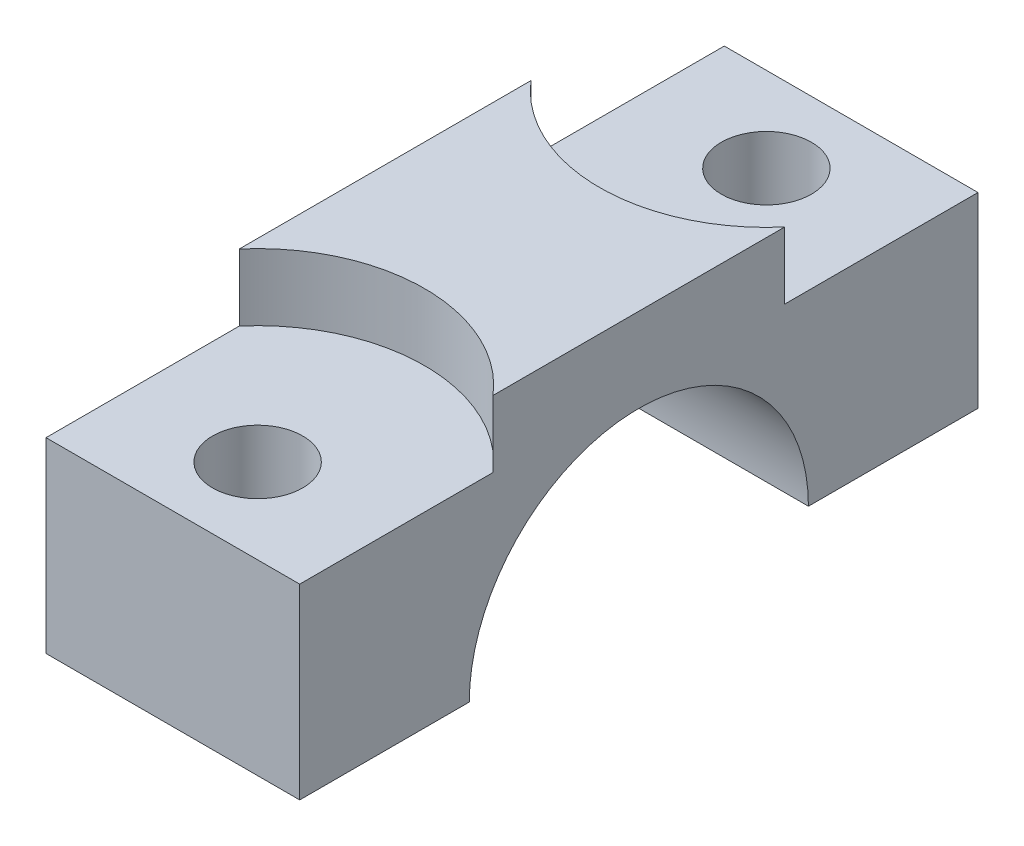
ISO-10303-21;
HEADER;
FILE_DESCRIPTION(('STEP AP214'),'2;1');
FILE_NAME('part.step','',(''),(''),'','','');
FILE_SCHEMA(('AUTOMOTIVE_DESIGN { 1 0 10303 214 1 1 1 1 }'));
ENDSEC;
DATA;
#1=APPLICATION_CONTEXT('core data for automotive mechanical design processes');
#2=APPLICATION_PROTOCOL_DEFINITION('international standard','automotive_design',2000,#1);
#3=PRODUCT_CONTEXT('',#1,'mechanical');
#4=PRODUCT('Part','Part','',(#3));
#5=PRODUCT_RELATED_PRODUCT_CATEGORY('part','',(#4));
#6=PRODUCT_DEFINITION_FORMATION('','',#4);
#7=PRODUCT_DEFINITION_CONTEXT('part definition',#1,'design');
#8=PRODUCT_DEFINITION('design','',#6,#7);
#9=PRODUCT_DEFINITION_SHAPE('','',#8);
#10=(LENGTH_UNIT() NAMED_UNIT(*) SI_UNIT(.MILLI.,.METRE.));
#11=(NAMED_UNIT(*) PLANE_ANGLE_UNIT() SI_UNIT($,.RADIAN.));
#12=(NAMED_UNIT(*) SI_UNIT($,.STERADIAN.) SOLID_ANGLE_UNIT());
#13=UNCERTAINTY_MEASURE_WITH_UNIT(LENGTH_MEASURE(1.E-05),#10,'distance_accuracy_value','');
#14=(GEOMETRIC_REPRESENTATION_CONTEXT(3) GLOBAL_UNCERTAINTY_ASSIGNED_CONTEXT((#13)) GLOBAL_UNIT_ASSIGNED_CONTEXT((#10,
#11,#12)) REPRESENTATION_CONTEXT('',''));
#15=CARTESIAN_POINT('',(0.,0.,0.));
#16=DIRECTION('',(0.,0.,1.));
#17=DIRECTION('',(1.,0.,0.));
#18=AXIS2_PLACEMENT_3D('',#15,#16,#17);
#19=CARTESIAN_POINT('',(9.5,19.,25.4));
#20=DIRECTION('',(0.,-1.,0.));
#21=DIRECTION('',(0.,0.,-1.));
#22=AXIS2_PLACEMENT_3D('',#19,#20,#21);
#23=PLANE('',#22);
#24=CARTESIAN_POINT('',(0.,19.,-19.05));
#25=DIRECTION('',(0.,1.,0.));
#26=DIRECTION('',(0.,0.,1.));
#27=AXIS2_PLACEMENT_3D('',#24,#25,#26);
#28=CIRCLE('',#27,12.5);
#29=CARTESIAN_POINT('',(-9.5,19.,-10.925961595364));
#30=VERTEX_POINT('',#29);
#31=CARTESIAN_POINT('',(9.5,19.,-10.925961595364));
#32=VERTEX_POINT('',#31);
#33=EDGE_CURVE('E58',#30,#32,#28,.T.);
#34=ORIENTED_EDGE('',*,*,#33,.F.);
#35=DIRECTION('',(0.,0.,1.));
#36=VECTOR('',#35,1.);
#37=CARTESIAN_POINT('',(-9.5,19.,25.4));
#38=LINE('',#37,#36);
#39=CARTESIAN_POINT('',(-9.5,19.,10.925961595364));
#40=VERTEX_POINT('',#39);
#41=EDGE_CURVE('E65',#30,#40,#38,.T.);
#42=ORIENTED_EDGE('',*,*,#41,.T.);
#43=CARTESIAN_POINT('',(0.,19.,19.05));
#44=DIRECTION('',(0.,1.,0.));
#45=DIRECTION('',(0.,0.,1.));
#46=AXIS2_PLACEMENT_3D('',#43,#44,#45);
#47=CIRCLE('',#46,12.5);
#48=CARTESIAN_POINT('',(9.5,19.,10.925961595364));
#49=VERTEX_POINT('',#48);
#50=EDGE_CURVE('E217',#49,#40,#47,.T.);
#51=ORIENTED_EDGE('',*,*,#50,.F.);
#52=DIRECTION('',(0.,0.,1.));
#53=VECTOR('',#52,1.);
#54=CARTESIAN_POINT('',(9.5,19.,25.4));
#55=LINE('',#54,#53);
#56=EDGE_CURVE('E142',#32,#49,#55,.T.);
#57=ORIENTED_EDGE('',*,*,#56,.F.);
#58=EDGE_LOOP('',(#34,#42,#51,#57));
#59=FACE_BOUND('',#58,.T.);
#60=ADVANCED_FACE('F43',(#59),#23,.F.);
#61=CARTESIAN_POINT('',(9.5,19.,25.4));
#62=DIRECTION('',(0.,0.,-1.));
#63=DIRECTION('',(0.,1.,0.));
#64=AXIS2_PLACEMENT_3D('',#61,#62,#63);
#65=PLANE('',#64);
#66=DIRECTION('',(0.,-1.,0.));
#67=VECTOR('',#66,1.);
#68=CARTESIAN_POINT('',(9.5,19.,25.4));
#69=LINE('',#68,#67);
#70=CARTESIAN_POINT('',(9.5,14.,25.4));
#71=VERTEX_POINT('',#70);
#72=CARTESIAN_POINT('',(9.5,0.,25.4));
#73=VERTEX_POINT('',#72);
#74=EDGE_CURVE('E163',#71,#73,#69,.T.);
#75=ORIENTED_EDGE('',*,*,#74,.F.);
#76=DIRECTION('',(-1.,0.,0.));
#77=VECTOR('',#76,1.);
#78=CARTESIAN_POINT('',(9.5,14.,25.4));
#79=LINE('',#78,#77);
#80=CARTESIAN_POINT('',(-9.5,14.,25.4));
#81=VERTEX_POINT('',#80);
#82=EDGE_CURVE('E187',#71,#81,#79,.T.);
#83=ORIENTED_EDGE('',*,*,#82,.T.);
#84=DIRECTION('',(0.,-1.,0.));
#85=VECTOR('',#84,1.);
#86=CARTESIAN_POINT('',(-9.5,19.,25.4));
#87=LINE('',#86,#85);
#88=CARTESIAN_POINT('',(-9.5,0.,25.4));
#89=VERTEX_POINT('',#88);
#90=EDGE_CURVE('E150',#81,#89,#87,.T.);
#91=ORIENTED_EDGE('',*,*,#90,.T.);
#92=DIRECTION('',(-1.,0.,0.));
#93=VECTOR('',#92,1.);
#94=CARTESIAN_POINT('',(9.5,0.,25.4));
#95=LINE('',#94,#93);
#96=EDGE_CURVE('E171',#73,#89,#95,.T.);
#97=ORIENTED_EDGE('',*,*,#96,.F.);
#98=EDGE_LOOP('',(#75,#83,#91,#97));
#99=FACE_BOUND('',#98,.T.);
#100=ADVANCED_FACE('F45',(#99),#65,.F.);
#101=CARTESIAN_POINT('',(9.5,0.,25.4));
#102=DIRECTION('',(0.,1.,0.));
#103=DIRECTION('',(0.,0.,1.));
#104=AXIS2_PLACEMENT_3D('',#101,#102,#103);
#105=PLANE('',#104);
#106=CARTESIAN_POINT('',(0.,0.,19.05));
#107=DIRECTION('',(0.,1.,0.));
#108=DIRECTION('',(0.,0.,1.));
#109=AXIS2_PLACEMENT_3D('',#106,#107,#108);
#110=CIRCLE('',#109,3.375);
#111=CARTESIAN_POINT('',(0.,0.,22.425));
#112=VERTEX_POINT('',#111);
#113=EDGE_CURVE('E198',#112,#112,#110,.T.);
#114=ORIENTED_EDGE('',*,*,#113,.T.);
#115=EDGE_LOOP('',(#114));
#116=FACE_BOUND('',#115,.T.);
#117=DIRECTION('',(0.,0.,-1.));
#118=VECTOR('',#117,1.);
#119=CARTESIAN_POINT('',(-9.5,0.,25.4));
#120=LINE('',#119,#118);
#121=CARTESIAN_POINT('',(-9.5,0.,12.7));
#122=VERTEX_POINT('',#121);
#123=EDGE_CURVE('E152',#89,#122,#120,.T.);
#124=ORIENTED_EDGE('',*,*,#123,.T.);
#125=DIRECTION('',(-1.,0.,0.));
#126=VECTOR('',#125,1.);
#127=CARTESIAN_POINT('',(9.5,0.,12.7));
#128=LINE('',#127,#126);
#129=CARTESIAN_POINT('',(9.5,0.,12.7));
#130=VERTEX_POINT('',#129);
#131=EDGE_CURVE('E168',#130,#122,#128,.T.);
#132=ORIENTED_EDGE('',*,*,#131,.F.);
#133=DIRECTION('',(0.,0.,-1.));
#134=VECTOR('',#133,1.);
#135=CARTESIAN_POINT('',(9.5,0.,25.4));
#136=LINE('',#135,#134);
#137=EDGE_CURVE('E203',#73,#130,#136,.T.);
#138=ORIENTED_EDGE('',*,*,#137,.F.);
#139=ORIENTED_EDGE('',*,*,#96,.T.);
#140=EDGE_LOOP('',(#124,#132,#138,#139));
#141=FACE_BOUND('',#140,.T.);
#142=ADVANCED_FACE('F230',(#116,#141),#105,.F.);
#143=CARTESIAN_POINT('',(9.5,0.,0.));
#144=DIRECTION('',(-1.,0.,0.));
#145=DIRECTION('',(0.,0.,1.));
#146=AXIS2_PLACEMENT_3D('',#143,#144,#145);
#147=CYLINDRICAL_SURFACE('',#146,12.7);
#148=CARTESIAN_POINT('',(-9.5,0.,0.));
#149=DIRECTION('',(-1.,0.,0.));
#150=DIRECTION('',(0.,0.,-1.));
#151=AXIS2_PLACEMENT_3D('',#148,#149,#150);
#152=CIRCLE('',#151,12.7);
#153=CARTESIAN_POINT('',(-9.5,0.,-12.7));
#154=VERTEX_POINT('',#153);
#155=EDGE_CURVE('E155',#122,#154,#152,.T.);
#156=ORIENTED_EDGE('',*,*,#155,.T.);
#157=DIRECTION('',(-1.,0.,0.));
#158=VECTOR('',#157,1.);
#159=CARTESIAN_POINT('',(9.5,0.,-12.7));
#160=LINE('',#159,#158);
#161=CARTESIAN_POINT('',(9.5,0.,-12.7));
#162=VERTEX_POINT('',#161);
#163=EDGE_CURVE('E165',#162,#154,#160,.T.);
#164=ORIENTED_EDGE('',*,*,#163,.F.);
#165=CARTESIAN_POINT('',(9.5,0.,0.));
#166=DIRECTION('',(-1.,0.,0.));
#167=DIRECTION('',(0.,0.,-1.));
#168=AXIS2_PLACEMENT_3D('',#165,#166,#167);
#169=CIRCLE('',#168,12.7);
#170=EDGE_CURVE('E146',#130,#162,#169,.T.);
#171=ORIENTED_EDGE('',*,*,#170,.F.);
#172=ORIENTED_EDGE('',*,*,#131,.T.);
#173=EDGE_LOOP('',(#156,#164,#171,#172));
#174=FACE_BOUND('',#173,.T.);
#175=ADVANCED_FACE('F209',(#174),#147,.F.);
#176=CARTESIAN_POINT('',(9.5,0.,-12.7));
#177=DIRECTION('',(0.,1.,0.));
#178=DIRECTION('',(0.,0.,1.));
#179=AXIS2_PLACEMENT_3D('',#176,#177,#178);
#180=PLANE('',#179);
#181=CARTESIAN_POINT('',(0.,0.,-19.05));
#182=DIRECTION('',(0.,1.,0.));
#183=DIRECTION('',(0.,0.,1.));
#184=AXIS2_PLACEMENT_3D('',#181,#182,#183);
#185=CIRCLE('',#184,3.375);
#186=CARTESIAN_POINT('',(0.,0.,-15.675));
#187=VERTEX_POINT('',#186);
#188=EDGE_CURVE('E340',#187,#187,#185,.T.);
#189=ORIENTED_EDGE('',*,*,#188,.T.);
#190=EDGE_LOOP('',(#189));
#191=FACE_BOUND('',#190,.T.);
#192=DIRECTION('',(0.,0.,-1.));
#193=VECTOR('',#192,1.);
#194=CARTESIAN_POINT('',(-9.5,0.,-12.7));
#195=LINE('',#194,#193);
#196=CARTESIAN_POINT('',(-9.5,0.,-25.4));
#197=VERTEX_POINT('',#196);
#198=EDGE_CURVE('E157',#154,#197,#195,.T.);
#199=ORIENTED_EDGE('',*,*,#198,.T.);
#200=DIRECTION('',(-1.,0.,0.));
#201=VECTOR('',#200,1.);
#202=CARTESIAN_POINT('',(9.5,0.,-25.4));
#203=LINE('',#202,#201);
#204=CARTESIAN_POINT('',(9.5,0.,-25.4));
#205=VERTEX_POINT('',#204);
#206=EDGE_CURVE('E144',#205,#197,#203,.T.);
#207=ORIENTED_EDGE('',*,*,#206,.F.);
#208=DIRECTION('',(0.,0.,-1.));
#209=VECTOR('',#208,1.);
#210=CARTESIAN_POINT('',(9.5,0.,-12.7));
#211=LINE('',#210,#209);
#212=EDGE_CURVE('E138',#162,#205,#211,.T.);
#213=ORIENTED_EDGE('',*,*,#212,.F.);
#214=ORIENTED_EDGE('',*,*,#163,.T.);
#215=EDGE_LOOP('',(#199,#207,#213,#214));
#216=FACE_BOUND('',#215,.T.);
#217=ADVANCED_FACE('F213',(#191,#216),#180,.F.);
#218=CARTESIAN_POINT('',(9.5,19.,-25.4));
#219=DIRECTION('',(0.,0.,1.));
#220=DIRECTION('',(0.,-1.,0.));
#221=AXIS2_PLACEMENT_3D('',#218,#219,#220);
#222=PLANE('',#221);
#223=DIRECTION('',(0.,1.,0.));
#224=VECTOR('',#223,1.);
#225=CARTESIAN_POINT('',(-9.5,19.,-25.4));
#226=LINE('',#225,#224);
#227=CARTESIAN_POINT('',(-9.5,14.,-25.4));
#228=VERTEX_POINT('',#227);
#229=EDGE_CURVE('E159',#197,#228,#226,.T.);
#230=ORIENTED_EDGE('',*,*,#229,.T.);
#231=DIRECTION('',(1.,0.,0.));
#232=VECTOR('',#231,1.);
#233=CARTESIAN_POINT('',(9.5,14.,-25.4));
#234=LINE('',#233,#232);
#235=CARTESIAN_POINT('',(9.5,14.,-25.4));
#236=VERTEX_POINT('',#235);
#237=EDGE_CURVE('E218',#228,#236,#234,.T.);
#238=ORIENTED_EDGE('',*,*,#237,.T.);
#239=DIRECTION('',(0.,1.,0.));
#240=VECTOR('',#239,1.);
#241=CARTESIAN_POINT('',(9.5,19.,-25.4));
#242=LINE('',#241,#240);
#243=EDGE_CURVE('E136',#205,#236,#242,.T.);
#244=ORIENTED_EDGE('',*,*,#243,.F.);
#245=ORIENTED_EDGE('',*,*,#206,.T.);
#246=EDGE_LOOP('',(#230,#238,#244,#245));
#247=FACE_BOUND('',#246,.T.);
#248=ADVANCED_FACE('F215',(#247),#222,.F.);
#249=CARTESIAN_POINT('',(9.5,0.,0.));
#250=DIRECTION('',(1.,0.,0.));
#251=DIRECTION('',(0.,0.,-1.));
#252=AXIS2_PLACEMENT_3D('',#249,#250,#251);
#253=PLANE('',#252);
#254=DIRECTION('',(0.,0.,-1.));
#255=VECTOR('',#254,1.);
#256=CARTESIAN_POINT('',(9.5,14.,0.));
#257=LINE('',#256,#255);
#258=CARTESIAN_POINT('',(9.5,14.,-10.925961595364));
#259=VERTEX_POINT('',#258);
#260=EDGE_CURVE('E11',#259,#236,#257,.T.);
#261=ORIENTED_EDGE('',*,*,#260,.F.);
#262=DIRECTION('',(0.,1.,0.));
#263=VECTOR('',#262,1.);
#264=CARTESIAN_POINT('',(9.5,19.,-10.925961595364));
#265=LINE('',#264,#263);
#266=EDGE_CURVE('E51',#32,#259,#265,.F.);
#267=ORIENTED_EDGE('',*,*,#266,.F.);
#268=ORIENTED_EDGE('',*,*,#56,.T.);
#269=DIRECTION('',(0.,1.,0.));
#270=VECTOR('',#269,1.);
#271=CARTESIAN_POINT('',(9.5,19.,10.925961595364));
#272=LINE('',#271,#270);
#273=CARTESIAN_POINT('',(9.5,14.,10.925961595364));
#274=VERTEX_POINT('',#273);
#275=EDGE_CURVE('E194',#274,#49,#272,.T.);
#276=ORIENTED_EDGE('',*,*,#275,.F.);
#277=DIRECTION('',(0.,0.,-1.));
#278=VECTOR('',#277,1.);
#279=CARTESIAN_POINT('',(9.5,14.,0.));
#280=LINE('',#279,#278);
#281=EDGE_CURVE('E153',#71,#274,#280,.T.);
#282=ORIENTED_EDGE('',*,*,#281,.F.);
#283=ORIENTED_EDGE('',*,*,#74,.T.);
#284=ORIENTED_EDGE('',*,*,#137,.T.);
#285=ORIENTED_EDGE('',*,*,#170,.T.);
#286=ORIENTED_EDGE('',*,*,#212,.T.);
#287=ORIENTED_EDGE('',*,*,#243,.T.);
#288=EDGE_LOOP('',(#261,#267,#268,#276,#282,#283,#284,#285,#286,#287));
#289=FACE_BOUND('',#288,.T.);
#290=ADVANCED_FACE('F134',(#289),#253,.T.);
#291=CARTESIAN_POINT('',(-9.5,0.,0.));
#292=DIRECTION('',(1.,0.,0.));
#293=DIRECTION('',(0.,0.,-1.));
#294=AXIS2_PLACEMENT_3D('',#291,#292,#293);
#295=PLANE('',#294);
#296=DIRECTION('',(0.,1.,0.));
#297=VECTOR('',#296,1.);
#298=CARTESIAN_POINT('',(-9.5,19.,-10.925961595364));
#299=LINE('',#298,#297);
#300=CARTESIAN_POINT('',(-9.5,14.,-10.925961595364));
#301=VERTEX_POINT('',#300);
#302=EDGE_CURVE('E216',#30,#301,#299,.F.);
#303=ORIENTED_EDGE('',*,*,#302,.T.);
#304=DIRECTION('',(0.,0.,-1.));
#305=VECTOR('',#304,1.);
#306=CARTESIAN_POINT('',(-9.5,14.,0.));
#307=LINE('',#306,#305);
#308=EDGE_CURVE('E130',#301,#228,#307,.T.);
#309=ORIENTED_EDGE('',*,*,#308,.T.);
#310=ORIENTED_EDGE('',*,*,#229,.F.);
#311=ORIENTED_EDGE('',*,*,#198,.F.);
#312=ORIENTED_EDGE('',*,*,#155,.F.);
#313=ORIENTED_EDGE('',*,*,#123,.F.);
#314=ORIENTED_EDGE('',*,*,#90,.F.);
#315=DIRECTION('',(0.,0.,-1.));
#316=VECTOR('',#315,1.);
#317=CARTESIAN_POINT('',(-9.5,14.,0.));
#318=LINE('',#317,#316);
#319=CARTESIAN_POINT('',(-9.5,14.,10.925961595364));
#320=VERTEX_POINT('',#319);
#321=EDGE_CURVE('E125',#81,#320,#318,.T.);
#322=ORIENTED_EDGE('',*,*,#321,.T.);
#323=DIRECTION('',(0.,1.,0.));
#324=VECTOR('',#323,1.);
#325=CARTESIAN_POINT('',(-9.5,19.,10.925961595364));
#326=LINE('',#325,#324);
#327=EDGE_CURVE('E174',#320,#40,#326,.T.);
#328=ORIENTED_EDGE('',*,*,#327,.T.);
#329=ORIENTED_EDGE('',*,*,#41,.F.);
#330=EDGE_LOOP('',(#303,#309,#310,#311,#312,#313,#314,#322,#328,#329));
#331=FACE_BOUND('',#330,.T.);
#332=ADVANCED_FACE('F180',(#331),#295,.F.);
#333=CARTESIAN_POINT('',(0.,19.,19.05));
#334=DIRECTION('',(0.,1.,0.));
#335=DIRECTION('',(0.,0.,1.));
#336=AXIS2_PLACEMENT_3D('',#333,#334,#335);
#337=CYLINDRICAL_SURFACE('',#336,3.375);
#338=ORIENTED_EDGE('',*,*,#113,.F.);
#339=EDGE_LOOP('',(#338));
#340=FACE_BOUND('',#339,.T.);
#341=CARTESIAN_POINT('',(0.,14.,19.05));
#342=DIRECTION('',(0.,1.,0.));
#343=DIRECTION('',(0.,0.,1.));
#344=AXIS2_PLACEMENT_3D('',#341,#342,#343);
#345=CIRCLE('',#344,3.375);
#346=CARTESIAN_POINT('',(0.,14.,22.425));
#347=VERTEX_POINT('',#346);
#348=EDGE_CURVE('E225',#347,#347,#345,.T.);
#349=ORIENTED_EDGE('',*,*,#348,.T.);
#350=EDGE_LOOP('',(#349));
#351=FACE_BOUND('',#350,.T.);
#352=ADVANCED_FACE('F233',(#340,#351),#337,.F.);
#353=CARTESIAN_POINT('',(3.375,14.,19.05));
#354=DIRECTION('',(0.,-1.,0.));
#355=DIRECTION('',(0.,0.,-1.));
#356=AXIS2_PLACEMENT_3D('',#353,#354,#355);
#357=PLANE('',#356);
#358=ORIENTED_EDGE('',*,*,#281,.T.);
#359=CARTESIAN_POINT('',(0.,14.,19.05));
#360=DIRECTION('',(0.,1.,0.));
#361=DIRECTION('',(0.,0.,1.));
#362=AXIS2_PLACEMENT_3D('',#359,#360,#361);
#363=CIRCLE('',#362,12.5);
#364=EDGE_CURVE('E190',#274,#320,#363,.T.);
#365=ORIENTED_EDGE('',*,*,#364,.T.);
#366=ORIENTED_EDGE('',*,*,#321,.F.);
#367=ORIENTED_EDGE('',*,*,#82,.F.);
#368=EDGE_LOOP('',(#358,#365,#366,#367));
#369=FACE_BOUND('',#368,.T.);
#370=ORIENTED_EDGE('',*,*,#348,.F.);
#371=EDGE_LOOP('',(#370));
#372=FACE_BOUND('',#371,.T.);
#373=ADVANCED_FACE('F185',(#369,#372),#357,.F.);
#374=CARTESIAN_POINT('',(0.,19.,19.05));
#375=DIRECTION('',(0.,1.,0.));
#376=DIRECTION('',(0.,0.,1.));
#377=AXIS2_PLACEMENT_3D('',#374,#375,#376);
#378=CYLINDRICAL_SURFACE('',#377,12.5);
#379=ORIENTED_EDGE('',*,*,#275,.T.);
#380=ORIENTED_EDGE('',*,*,#50,.T.);
#381=ORIENTED_EDGE('',*,*,#327,.F.);
#382=ORIENTED_EDGE('',*,*,#364,.F.);
#383=EDGE_LOOP('',(#379,#380,#381,#382));
#384=FACE_BOUND('',#383,.T.);
#385=ADVANCED_FACE('F239',(#384),#378,.F.);
#386=CARTESIAN_POINT('',(3.375,14.,-19.05));
#387=DIRECTION('',(0.,-1.,0.));
#388=DIRECTION('',(0.,0.,-1.));
#389=AXIS2_PLACEMENT_3D('',#386,#387,#388);
#390=PLANE('',#389);
#391=CARTESIAN_POINT('',(0.,14.,-19.05));
#392=DIRECTION('',(0.,1.,0.));
#393=DIRECTION('',(0.,0.,1.));
#394=AXIS2_PLACEMENT_3D('',#391,#392,#393);
#395=CIRCLE('',#394,3.375);
#396=CARTESIAN_POINT('',(0.,14.,-15.675));
#397=VERTEX_POINT('',#396);
#398=EDGE_CURVE('E131',#397,#397,#395,.T.);
#399=ORIENTED_EDGE('',*,*,#398,.F.);
#400=EDGE_LOOP('',(#399));
#401=FACE_BOUND('',#400,.T.);
#402=CARTESIAN_POINT('',(0.,14.,-19.05));
#403=DIRECTION('',(0.,1.,0.));
#404=DIRECTION('',(0.,0.,1.));
#405=AXIS2_PLACEMENT_3D('',#402,#403,#404);
#406=CIRCLE('',#405,12.5);
#407=EDGE_CURVE('E120',#301,#259,#406,.T.);
#408=ORIENTED_EDGE('',*,*,#407,.T.);
#409=ORIENTED_EDGE('',*,*,#260,.T.);
#410=ORIENTED_EDGE('',*,*,#237,.F.);
#411=ORIENTED_EDGE('',*,*,#308,.F.);
#412=EDGE_LOOP('',(#408,#409,#410,#411));
#413=FACE_BOUND('',#412,.T.);
#414=ADVANCED_FACE('F127',(#401,#413),#390,.F.);
#415=CARTESIAN_POINT('',(0.,19.,-19.05));
#416=DIRECTION('',(0.,1.,0.));
#417=DIRECTION('',(0.,0.,1.));
#418=AXIS2_PLACEMENT_3D('',#415,#416,#417);
#419=CYLINDRICAL_SURFACE('',#418,12.5);
#420=ORIENTED_EDGE('',*,*,#33,.T.);
#421=ORIENTED_EDGE('',*,*,#266,.T.);
#422=ORIENTED_EDGE('',*,*,#407,.F.);
#423=ORIENTED_EDGE('',*,*,#302,.F.);
#424=EDGE_LOOP('',(#420,#421,#422,#423));
#425=FACE_BOUND('',#424,.T.);
#426=ADVANCED_FACE('F119',(#425),#419,.F.);
#427=CARTESIAN_POINT('',(0.,19.,-19.05));
#428=DIRECTION('',(0.,1.,0.));
#429=DIRECTION('',(0.,0.,1.));
#430=AXIS2_PLACEMENT_3D('',#427,#428,#429);
#431=CYLINDRICAL_SURFACE('',#430,3.375);
#432=ORIENTED_EDGE('',*,*,#188,.F.);
#433=EDGE_LOOP('',(#432));
#434=FACE_BOUND('',#433,.T.);
#435=ORIENTED_EDGE('',*,*,#398,.T.);
#436=EDGE_LOOP('',(#435));
#437=FACE_BOUND('',#436,.T.);
#438=ADVANCED_FACE('F325',(#434,#437),#431,.F.);
#439=CLOSED_SHELL('',(#60,#100,#142,#175,#217,#248,#290,#332,#352,#373,#385,#414,#426,#438));
#440=MANIFOLD_SOLID_BREP('B2',#439);
#441=ADVANCED_BREP_SHAPE_REPRESENTATION('',(#18,#440),#14);
#442=SHAPE_DEFINITION_REPRESENTATION(#9,#441);
ENDSEC;
END-ISO-10303-21;
